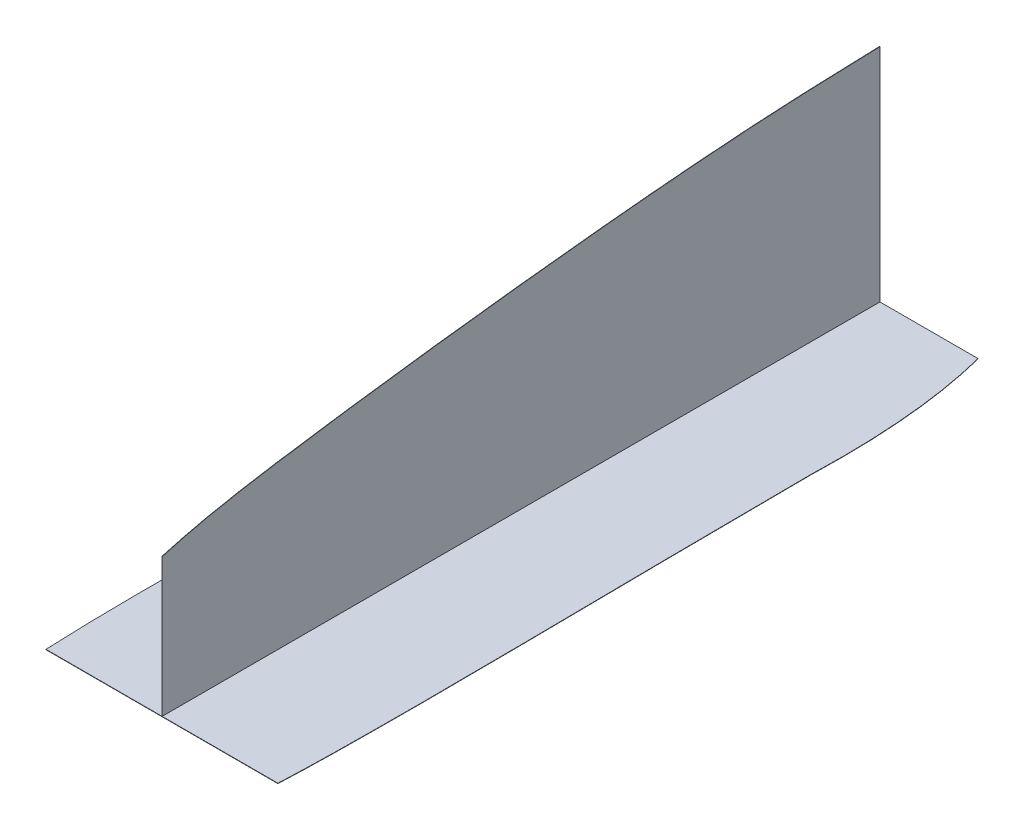
ISO-10303-21;
HEADER;
FILE_DESCRIPTION(('STEP AP214'),'2;1');
FILE_NAME('part.step','',(''),(''),'','','');
FILE_SCHEMA(('AUTOMOTIVE_DESIGN { 1 0 10303 214 1 1 1 1 }'));
ENDSEC;
DATA;
#1=APPLICATION_CONTEXT('core data for automotive mechanical design processes');
#2=APPLICATION_PROTOCOL_DEFINITION('international standard','automotive_design',2000,#1);
#3=PRODUCT_CONTEXT('',#1,'mechanical');
#4=PRODUCT('Part','Part','',(#3));
#5=PRODUCT_RELATED_PRODUCT_CATEGORY('part','',(#4));
#6=PRODUCT_DEFINITION_FORMATION('','',#4);
#7=PRODUCT_DEFINITION_CONTEXT('part definition',#1,'design');
#8=PRODUCT_DEFINITION('design','',#6,#7);
#9=PRODUCT_DEFINITION_SHAPE('','',#8);
#10=(LENGTH_UNIT() NAMED_UNIT(*) SI_UNIT(.MILLI.,.METRE.));
#11=(NAMED_UNIT(*) PLANE_ANGLE_UNIT() SI_UNIT($,.RADIAN.));
#12=(NAMED_UNIT(*) SI_UNIT($,.STERADIAN.) SOLID_ANGLE_UNIT());
#13=UNCERTAINTY_MEASURE_WITH_UNIT(LENGTH_MEASURE(1.E-05),#10,'distance_accuracy_value','');
#14=(GEOMETRIC_REPRESENTATION_CONTEXT(3) GLOBAL_UNCERTAINTY_ASSIGNED_CONTEXT((#13)) GLOBAL_UNIT_ASSIGNED_CONTEXT((#10,
#11,#12)) REPRESENTATION_CONTEXT('',''));
#15=CARTESIAN_POINT('',(0.,0.,0.));
#16=DIRECTION('',(0.,0.,1.));
#17=DIRECTION('',(1.,0.,0.));
#18=AXIS2_PLACEMENT_3D('',#15,#16,#17);
#19=CARTESIAN_POINT('',(589.383947508384,1009.16071536453,602.1399116742));
#20=DIRECTION('',(1.,0.,0.));
#21=DIRECTION('',(0.,0.,-1.));
#22=AXIS2_PLACEMENT_3D('',#19,#20,#21);
#23=PLANE('',#22);
#24=DIRECTION('',(0.,-1.,0.));
#25=VECTOR('',#24,1.);
#26=CARTESIAN_POINT('',(589.383947508384,1009.16071536453,602.1399116742));
#27=LINE('',#26,#25);
#28=CARTESIAN_POINT('',(589.383947508384,1611.78849720543,602.1399116742));
#29=VERTEX_POINT('',#28);
#30=CARTESIAN_POINT('',(589.383947508384,1010.16071536453,602.1399116742));
#31=VERTEX_POINT('',#30);
#32=EDGE_CURVE('E52',#29,#31,#27,.T.);
#33=ORIENTED_EDGE('',*,*,#32,.T.);
#34=DIRECTION('',(0.,0.,1.));
#35=VECTOR('',#34,1.);
#36=CARTESIAN_POINT('',(589.383947508384,1010.16071536453,602.1399116742));
#37=LINE('',#36,#35);
#38=CARTESIAN_POINT('',(589.383947508384,1010.16071536453,2554.9524376359));
#39=VERTEX_POINT('',#38);
#40=EDGE_CURVE('E56',#31,#39,#37,.T.);
#41=ORIENTED_EDGE('',*,*,#40,.T.);
#42=DIRECTION('',(0.,-1.,0.));
#43=VECTOR('',#42,1.);
#44=CARTESIAN_POINT('',(589.383947508384,1009.16071536453,2554.9524376359));
#45=LINE('',#44,#43);
#46=CARTESIAN_POINT('',(589.383947508384,1386.42141994183,2554.9524376359));
#47=VERTEX_POINT('',#46);
#48=EDGE_CURVE('E340',#47,#39,#45,.T.);
#49=ORIENTED_EDGE('',*,*,#48,.F.);
#50=CARTESIAN_POINT('',(589.383947508384,1563.05007326583,1355.1524376188));
#51=CARTESIAN_POINT('',(589.383947508384,1532.3402899185,1661.8874997417));
#52=CARTESIAN_POINT('',(589.383947508385,1476.98103839461,2092.25057555961));
#53=CARTESIAN_POINT('',(589.383947508385,1424.39977596157,2408.98943516324));
#54=CARTESIAN_POINT('',(589.383947508385,1398.89169061797,2511.88013056057));
#55=CARTESIAN_POINT('',(589.383947508385,1386.42141994183,2554.9524376359));
#56=B_SPLINE_CURVE_WITH_KNOTS('',3,(#50,#51,#52,#53,#54,#55),.UNSPECIFIED.,.F.,.F.,(4,1,1,4),
(0.108777165329481,0.189662496599539,0.216203450861303,0.238160453777761),.UNSPECIFIED.);
#57=CARTESIAN_POINT('',(589.383947508384,1563.05007326583,1355.1524376188));
#58=VERTEX_POINT('',#57);
#59=EDGE_CURVE('E263',#58,#47,#56,.T.);
#60=ORIENTED_EDGE('',*,*,#59,.F.);
#61=CARTESIAN_POINT('',(589.383947508384,1611.78849720543,602.1399116742));
#62=CARTESIAN_POINT('',(589.383947508384,1608.27208834806,715.657069267075));
#63=CARTESIAN_POINT('',(589.383947508384,1601.34313937165,931.648537269468));
#64=CARTESIAN_POINT('',(589.383947508384,1577.70214267697,1208.76652661467));
#65=CARTESIAN_POINT('',(589.383947508384,1563.05007326583,1355.1524376188));
#66=B_SPLINE_CURVE_WITH_KNOTS('',3,(#61,#62,#63,#64,#65),.UNSPECIFIED.,.F.,.F.,(4,1,4),
(0.0336353400705244,0.0701384805700576,0.10874200477284),.UNSPECIFIED.);
#67=EDGE_CURVE('E270',#29,#58,#66,.T.);
#68=ORIENTED_EDGE('',*,*,#67,.F.);
#69=EDGE_LOOP('',(#33,#41,#49,#60,#68));
#70=FACE_BOUND('',#69,.T.);
#71=ADVANCED_FACE('F36',(#70),#23,.F.);
#72=CARTESIAN_POINT('',(590.383947508384,1009.16071536453,602.1399116742));
#73=DIRECTION('',(-1.,0.,0.));
#74=DIRECTION('',(0.,0.,1.));
#75=AXIS2_PLACEMENT_3D('',#72,#73,#74);
#76=PLANE('',#75);
#77=DIRECTION('',(0.,-1.,0.));
#78=VECTOR('',#77,1.);
#79=CARTESIAN_POINT('',(590.383947508384,1009.16071536453,2554.9524376359));
#80=LINE('',#79,#78);
#81=CARTESIAN_POINT('',(590.383947508384,1386.42141994183,2554.9524376359));
#82=VERTEX_POINT('',#81);
#83=CARTESIAN_POINT('',(590.383947508384,1010.16071536453,2554.9524376359));
#84=VERTEX_POINT('',#83);
#85=EDGE_CURVE('E338',#82,#84,#80,.T.);
#86=ORIENTED_EDGE('',*,*,#85,.T.);
#87=DIRECTION('',(0.,0.,-1.));
#88=VECTOR('',#87,1.);
#89=CARTESIAN_POINT('',(590.383947508384,1010.16071536453,602.1399116742));
#90=LINE('',#89,#88);
#91=CARTESIAN_POINT('',(590.383947508384,1010.16071536453,602.1399116742));
#92=VERTEX_POINT('',#91);
#93=EDGE_CURVE('E11',#84,#92,#90,.T.);
#94=ORIENTED_EDGE('',*,*,#93,.T.);
#95=DIRECTION('',(0.,-1.,0.));
#96=VECTOR('',#95,1.);
#97=CARTESIAN_POINT('',(590.383947508384,1009.16071536453,602.1399116742));
#98=LINE('',#97,#96);
#99=CARTESIAN_POINT('',(590.383947508384,1611.78849720543,602.1399116742));
#100=VERTEX_POINT('',#99);
#101=EDGE_CURVE('E273',#100,#92,#98,.T.);
#102=ORIENTED_EDGE('',*,*,#101,.F.);
#103=CARTESIAN_POINT('',(590.383947508384,1611.78849720543,602.1399116742));
#104=CARTESIAN_POINT('',(590.383947508384,1608.27208834806,715.657069267075));
#105=CARTESIAN_POINT('',(590.383947508384,1601.34313937165,931.648537269468));
#106=CARTESIAN_POINT('',(590.383947508384,1577.70214267697,1208.76652661467));
#107=CARTESIAN_POINT('',(590.383947508384,1563.05007326583,1355.1524376188));
#108=B_SPLINE_CURVE_WITH_KNOTS('',3,(#103,#104,#105,#106,#107),.UNSPECIFIED.,.F.,.F.,(4,1,4),
(0.0336353400705244,0.0701384805700576,0.10874200477284),.UNSPECIFIED.);
#109=CARTESIAN_POINT('',(590.383947508385,1563.05007326583,1355.1524376188));
#110=VERTEX_POINT('',#109);
#111=EDGE_CURVE('E268',#110,#100,#108,.F.);
#112=ORIENTED_EDGE('',*,*,#111,.F.);
#113=CARTESIAN_POINT('',(590.383947508384,1563.05007326583,1355.1524376188));
#114=CARTESIAN_POINT('',(590.383947508384,1532.3402899185,1661.8874997417));
#115=CARTESIAN_POINT('',(590.383947508385,1476.98103839461,2092.25057555961));
#116=CARTESIAN_POINT('',(590.383947508385,1424.39977596157,2408.98943516324));
#117=CARTESIAN_POINT('',(590.383947508385,1398.89169061797,2511.88013056057));
#118=CARTESIAN_POINT('',(590.383947508385,1386.42141994183,2554.9524376359));
#119=B_SPLINE_CURVE_WITH_KNOTS('',3,(#113,#114,#115,#116,#117,#118),.UNSPECIFIED.,.F.,.F.,(4,1,
1,4),(0.108777165329481,0.189662496599539,0.216203450861303,0.238160453777761),.UNSPECIFIED.);
#120=EDGE_CURVE('E264',#82,#110,#119,.F.);
#121=ORIENTED_EDGE('',*,*,#120,.F.);
#122=EDGE_LOOP('',(#86,#94,#102,#112,#121));
#123=FACE_BOUND('',#122,.T.);
#124=ADVANCED_FACE('F225',(#123),#76,.F.);
#125=CARTESIAN_POINT('',(591.226262617765,1009.16071536453,674.1824168609));
#126=DIRECTION('',(0.,1.,0.));
#127=DIRECTION('',(1.,0.,0.));
#128=AXIS2_PLACEMENT_3D('',#125,#126,#127);
#129=PLANE('',#128);
#130=CARTESIAN_POINT('',(276.879543113384,1009.16071536453,1104.52250880301));
#131=CARTESIAN_POINT('',(270.241487642476,1009.16071536453,891.877004997745));
#132=CARTESIAN_POINT('',(290.003561901656,1009.16071536453,729.137352184355));
#133=CARTESIAN_POINT('',(322.642804705584,1009.16071536453,602.139911702002));
#134=B_SPLINE_CURVE_WITH_KNOTS('',3,(#130,#131,#132,#133),.UNSPECIFIED.,.F.,.F.,(4,4),
(0.571508355999422,1.),.UNSPECIFIED.);
#135=CARTESIAN_POINT('',(276.879543113384,1009.16071536453,1104.52250880301));
#136=VERTEX_POINT('',#135);
#137=CARTESIAN_POINT('',(322.642804705584,1009.16071536453,602.139911702002));
#138=VERTEX_POINT('',#137);
#139=EDGE_CURVE('E299',#136,#138,#134,.T.);
#140=ORIENTED_EDGE('',*,*,#139,.T.);
#141=DIRECTION('',(1.,0.,0.));
#142=VECTOR('',#141,1.);
#143=CARTESIAN_POINT('',(1034.32862425326,1009.16071536453,602.139911672));
#144=LINE('',#143,#142);
#145=CARTESIAN_POINT('',(857.122462797984,1009.16071536453,602.139911674201));
#146=VERTEX_POINT('',#145);
#147=EDGE_CURVE('E242',#138,#146,#144,.T.);
#148=ORIENTED_EDGE('',*,*,#147,.T.);
#149=CARTESIAN_POINT('',(857.122462797984,1009.16071536453,602.139911702001));
#150=CARTESIAN_POINT('',(889.761705601913,1009.16071536453,729.137352184355));
#151=CARTESIAN_POINT('',(909.523779861092,1009.16071536453,891.877004997746));
#152=CARTESIAN_POINT('',(902.885724390184,1009.16071536453,1104.52250880301));
#153=B_SPLINE_CURVE_WITH_KNOTS('',3,(#149,#150,#151,#152),.UNSPECIFIED.,.F.,.F.,(4,4),
(0.571508355999423,1.),.UNSPECIFIED.);
#154=CARTESIAN_POINT('',(902.885724390184,1009.16071536453,1104.52250880301));
#155=VERTEX_POINT('',#154);
#156=EDGE_CURVE('E296',#146,#155,#153,.T.);
#157=ORIENTED_EDGE('',*,*,#156,.T.);
#158=CARTESIAN_POINT('',(902.885724390184,1009.16071536453,1104.52250880301));
#159=CARTESIAN_POINT('',(903.672508803951,1009.16071536453,1233.03363169881));
#160=CARTESIAN_POINT('',(904.572435632125,1009.16071536453,1361.54390319702));
#161=CARTESIAN_POINT('',(905.565286362784,1009.16071536453,1490.0534754421));
#162=B_SPLINE_CURVE_WITH_KNOTS('',3,(#158,#159,#160,#161),.UNSPECIFIED.,.F.,.F.,(4,4),(0.,1.),.UNSPECIFIED.);
#163=CARTESIAN_POINT('',(905.561145012896,1009.16071536453,1489.51737029427));
#164=VERTEX_POINT('',#163);
#165=EDGE_CURVE('E308',#155,#164,#162,.T.);
#166=ORIENTED_EDGE('',*,*,#165,.T.);
#167=DIRECTION('',(-0.00775795305478673,0.,-0.999969906629394));
#168=VECTOR('',#167,1.);
#169=CARTESIAN_POINT('',(905.585482838039,1009.16071536453,1492.65442108127));
#170=LINE('',#169,#168);
#171=CARTESIAN_POINT('',(905.585482838039,1009.16071536453,1492.65442108127));
#172=VERTEX_POINT('',#171);
#173=EDGE_CURVE('E468',#172,#164,#170,.T.);
#174=ORIENTED_EDGE('',*,*,#173,.F.);
#175=CARTESIAN_POINT('',(905.565286362784,1009.16071536453,1490.0534754421));
#176=CARTESIAN_POINT('',(907.915875001607,1009.16071536453,1794.24613705781));
#177=CARTESIAN_POINT('',(914.310196912963,1009.16071536453,2098.51376508695));
#178=CARTESIAN_POINT('',(909.770934228902,1009.16071536453,2402.61644224091));
#179=B_SPLINE_CURVE_WITH_KNOTS('',3,(#175,#176,#177,#178),.UNSPECIFIED.,.F.,.F.,(4,4),(0.,1.),.UNSPECIFIED.);
#180=CARTESIAN_POINT('',(909.770934228902,1009.16071536453,2402.61644224091));
#181=VERTEX_POINT('',#180);
#182=EDGE_CURVE('E474',#172,#181,#179,.T.);
#183=ORIENTED_EDGE('',*,*,#182,.T.);
#184=DIRECTION('',(-0.0149255916419641,0.,0.999888607152886));
#185=VECTOR('',#184,1.);
#186=CARTESIAN_POINT('',(909.770934228902,1009.16071536453,2402.61644224091));
#187=LINE('',#186,#185);
#188=CARTESIAN_POINT('',(909.770828491298,1009.16071536453,2402.62352576752));
#189=VERTEX_POINT('',#188);
#190=EDGE_CURVE('E478',#181,#189,#187,.T.);
#191=ORIENTED_EDGE('',*,*,#190,.T.);
#192=CARTESIAN_POINT('',(909.770828491298,1009.16071536453,2402.62352576752));
#193=CARTESIAN_POINT('',(909.012624359779,1009.16071536453,2453.41506199992));
#194=CARTESIAN_POINT('',(907.695367575531,1009.16071536453,2504.19483774952));
#195=CARTESIAN_POINT('',(905.323947508384,1009.16071536453,2554.9524376466));
#196=B_SPLINE_CURVE_WITH_KNOTS('',3,(#192,#193,#194,#195),.UNSPECIFIED.,.F.,.F.,(4,4),(0.,1.),.UNSPECIFIED.);
#197=CARTESIAN_POINT('',(905.323947508384,1009.16071536453,2554.9524376466));
#198=VERTEX_POINT('',#197);
#199=EDGE_CURVE('E483',#189,#198,#196,.T.);
#200=ORIENTED_EDGE('',*,*,#199,.T.);
#201=DIRECTION('',(1.,0.,0.));
#202=VECTOR('',#201,1.);
#203=CARTESIAN_POINT('',(264.753636337917,1009.16071536453,2554.9524376466));
#204=LINE('',#203,#202);
#205=CARTESIAN_POINT('',(274.441319995184,1009.16071536453,2554.9524376466));
#206=VERTEX_POINT('',#205);
#207=EDGE_CURVE('E179',#206,#198,#204,.T.);
#208=ORIENTED_EDGE('',*,*,#207,.F.);
#209=CARTESIAN_POINT('',(274.441319995184,1009.16071536453,2554.9524376466));
#210=CARTESIAN_POINT('',(266.156255187132,1009.16071536453,2377.61987203674));
#211=CARTESIAN_POINT('',(268.71985785069,1009.16071536453,2200.05517892387));
#212=CARTESIAN_POINT('',(271.168372512958,1009.16071536453,1845.05258119717));
#213=CARTESIAN_POINT('',(272.82838089259,1009.16071536453,1667.55400585533));
#214=CARTESIAN_POINT('',(274.199981140784,1009.16071536453,1490.0534754421));
#215=B_SPLINE_CURVE_WITH_KNOTS('',3,(#209,#210,#211,#212,#213,#214),.UNSPECIFIED.,.F.,.F.,(4,2,
4),(0.,0.5,1.),.UNSPECIFIED.);
#216=CARTESIAN_POINT('',(274.193391193962,1009.16071536453,1490.90600220537));
#217=VERTEX_POINT('',#216);
#218=EDGE_CURVE('E319',#206,#217,#215,.T.);
#219=ORIENTED_EDGE('',*,*,#218,.T.);
#220=DIRECTION('',(-0.0077261395766045,0.,0.999970152938198));
#221=VECTOR('',#220,1.);
#222=CARTESIAN_POINT('',(274.208823615225,1009.16071536453,1488.90863204427));
#223=LINE('',#222,#221);
#224=CARTESIAN_POINT('',(274.208823615225,1009.16071536453,1488.90863204427));
#225=VERTEX_POINT('',#224);
#226=EDGE_CURVE('E162',#225,#217,#223,.T.);
#227=ORIENTED_EDGE('',*,*,#226,.F.);
#228=CARTESIAN_POINT('',(274.199981140784,1009.16071536453,1490.0534754421));
#229=CARTESIAN_POINT('',(275.192831872416,1009.16071536453,1361.54390307109));
#230=CARTESIAN_POINT('',(276.09275870044,1009.16071536453,1233.03363156436));
#231=CARTESIAN_POINT('',(276.879543113384,1009.16071536453,1104.52250880301));
#232=B_SPLINE_CURVE_WITH_KNOTS('',3,(#228,#229,#230,#231),.UNSPECIFIED.,.F.,.F.,(4,4),(0.,1.),.UNSPECIFIED.);
#233=EDGE_CURVE('E447',#225,#136,#232,.T.);
#234=ORIENTED_EDGE('',*,*,#233,.T.);
#235=EDGE_LOOP('',(#140,#148,#157,#166,#174,#183,#191,#200,#208,#219,#227,#234));
#236=FACE_BOUND('',#235,.T.);
#237=ADVANCED_FACE('F228',(#236),#129,.F.);
#238=CARTESIAN_POINT('',(591.226262617765,1197.77104661873,602.1399116742));
#239=DIRECTION('',(0.,0.,1.));
#240=DIRECTION('',(1.,0.,0.));
#241=AXIS2_PLACEMENT_3D('',#238,#239,#240);
#242=PLANE('',#241);
#243=ORIENTED_EDGE('',*,*,#101,.T.);
#244=DIRECTION('',(-1.,0.,0.));
#245=VECTOR('',#244,1.);
#246=CARTESIAN_POINT('',(392.759972132284,1010.16071536453,602.139911674201));
#247=LINE('',#246,#245);
#248=CARTESIAN_POINT('',(857.122462797984,1010.16071536453,602.139911674201));
#249=VERTEX_POINT('',#248);
#250=EDGE_CURVE('E312',#249,#92,#247,.T.);
#251=ORIENTED_EDGE('',*,*,#250,.F.);
#252=DIRECTION('',(0.,1.,0.));
#253=VECTOR('',#252,1.);
#254=CARTESIAN_POINT('',(857.122462797984,1008.67078649442,602.139911702001));
#255=LINE('',#254,#253);
#256=EDGE_CURVE('E195',#146,#249,#255,.T.);
#257=ORIENTED_EDGE('',*,*,#256,.F.);
#258=ORIENTED_EDGE('',*,*,#147,.F.);
#259=DIRECTION('',(0.,1.,0.));
#260=VECTOR('',#259,1.);
#261=CARTESIAN_POINT('',(322.642804705584,1008.67078649443,602.139911702002));
#262=LINE('',#261,#260);
#263=CARTESIAN_POINT('',(322.642804705584,1010.16071536453,602.139911702002));
#264=VERTEX_POINT('',#263);
#265=EDGE_CURVE('E180',#138,#264,#262,.T.);
#266=ORIENTED_EDGE('',*,*,#265,.T.);
#267=EDGE_CURVE('E343',#31,#264,#247,.T.);
#268=ORIENTED_EDGE('',*,*,#267,.F.);
#269=ORIENTED_EDGE('',*,*,#32,.F.);
#270=DIRECTION('',(-1.,0.,0.));
#271=VECTOR('',#270,1.);
#272=CARTESIAN_POINT('',(591.226262617765,1611.78849720543,602.1399116742));
#273=LINE('',#272,#271);
#274=EDGE_CURVE('E249',#100,#29,#273,.T.);
#275=ORIENTED_EDGE('',*,*,#274,.F.);
#276=EDGE_LOOP('',(#243,#251,#257,#258,#266,#268,#269,#275));
#277=FACE_BOUND('',#276,.T.);
#278=ADVANCED_FACE('F234',(#277),#242,.F.);
#279=CARTESIAN_POINT('',(591.226262617765,1563.05007326583,1355.1524376188));
#280=CARTESIAN_POINT('',(591.226262617765,1532.3402899185,1661.8874997417));
#281=CARTESIAN_POINT('',(591.226262617766,1476.98103839461,2092.25057555961));
#282=CARTESIAN_POINT('',(591.226262617766,1424.39977596157,2408.98943516324));
#283=CARTESIAN_POINT('',(591.226262617766,1398.89169061797,2511.88013056057));
#284=CARTESIAN_POINT('',(591.226262617766,1386.42141994183,2554.9524376359));
#285=B_SPLINE_CURVE_WITH_KNOTS('',3,(#279,#280,#281,#282,#283,#284),.UNSPECIFIED.,.F.,.F.,(4,1,
1,4),(0.108777165329481,0.189662496599539,0.216203450861303,0.238160453777761),.UNSPECIFIED.);
#286=DIRECTION('',(-1.,0.,0.));
#287=VECTOR('',#286,1.);
#288=SURFACE_OF_LINEAR_EXTRUSION('',#285,#287);
#289=DIRECTION('',(-1.,0.,0.));
#290=VECTOR('',#289,1.);
#291=CARTESIAN_POINT('',(591.226262617766,1386.42141994183,2554.9524376359));
#292=LINE('',#291,#290);
#293=EDGE_CURVE('E244',#82,#47,#292,.T.);
#294=ORIENTED_EDGE('',*,*,#293,.F.);
#295=ORIENTED_EDGE('',*,*,#120,.T.);
#296=DIRECTION('',(-1.,0.,0.));
#297=VECTOR('',#296,1.);
#298=CARTESIAN_POINT('',(591.226262617765,1563.05007326583,1355.1524376188));
#299=LINE('',#298,#297);
#300=EDGE_CURVE('E45',#110,#58,#299,.T.);
#301=ORIENTED_EDGE('',*,*,#300,.T.);
#302=ORIENTED_EDGE('',*,*,#59,.T.);
#303=EDGE_LOOP('',(#294,#295,#301,#302));
#304=FACE_BOUND('',#303,.T.);
#305=ADVANCED_FACE('F230',(#304),#288,.F.);
#306=CARTESIAN_POINT('',(507.638417351715,1059.20075743343,2554.9524376466));
#307=DIRECTION('',(0.,0.,1.));
#308=DIRECTION('',(1.,0.,0.));
#309=AXIS2_PLACEMENT_3D('',#306,#307,#308);
#310=PLANE('',#309);
#311=ORIENTED_EDGE('',*,*,#48,.T.);
#312=DIRECTION('',(-1.,0.,0.));
#313=VECTOR('',#312,1.);
#314=CARTESIAN_POINT('',(264.753636337917,1010.16071536453,2554.9524376466));
#315=LINE('',#314,#313);
#316=CARTESIAN_POINT('',(274.441319995184,1010.16071536453,2554.9524376466));
#317=VERTEX_POINT('',#316);
#318=EDGE_CURVE('E163',#39,#317,#315,.T.);
#319=ORIENTED_EDGE('',*,*,#318,.T.);
#320=DIRECTION('',(0.,1.,0.));
#321=VECTOR('',#320,1.);
#322=CARTESIAN_POINT('',(274.441319995184,1008.67078649443,2554.9524376466));
#323=LINE('',#322,#321);
#324=EDGE_CURVE('E173',#206,#317,#323,.T.);
#325=ORIENTED_EDGE('',*,*,#324,.F.);
#326=ORIENTED_EDGE('',*,*,#207,.T.);
#327=DIRECTION('',(0.,1.,0.));
#328=VECTOR('',#327,1.);
#329=CARTESIAN_POINT('',(905.323947508384,1008.67078649443,2554.9524376466));
#330=LINE('',#329,#328);
#331=CARTESIAN_POINT('',(905.323947508384,1010.16071536453,2554.9524376466));
#332=VERTEX_POINT('',#331);
#333=EDGE_CURVE('E170',#198,#332,#330,.T.);
#334=ORIENTED_EDGE('',*,*,#333,.T.);
#335=EDGE_CURVE('E153',#332,#84,#315,.T.);
#336=ORIENTED_EDGE('',*,*,#335,.T.);
#337=ORIENTED_EDGE('',*,*,#85,.F.);
#338=ORIENTED_EDGE('',*,*,#293,.T.);
#339=EDGE_LOOP('',(#311,#319,#325,#326,#334,#336,#337,#338));
#340=FACE_BOUND('',#339,.T.);
#341=ADVANCED_FACE('F177',(#340),#310,.T.);
#342=CARTESIAN_POINT('',(591.226262617765,1611.78849720543,602.1399116742));
#343=CARTESIAN_POINT('',(591.226262617765,1608.27208834806,715.657069267075));
#344=CARTESIAN_POINT('',(591.226262617765,1601.34313937165,931.648537269468));
#345=CARTESIAN_POINT('',(591.226262617765,1577.70214267697,1208.76652661467));
#346=CARTESIAN_POINT('',(591.226262617765,1563.05007326583,1355.1524376188));
#347=B_SPLINE_CURVE_WITH_KNOTS('',3,(#342,#343,#344,#345,#346),.UNSPECIFIED.,.F.,.F.,(4,1,4),
(0.0336353400705244,0.0701384805700576,0.10874200477284),.UNSPECIFIED.);
#348=DIRECTION('',(-1.,0.,0.));
#349=VECTOR('',#348,1.);
#350=SURFACE_OF_LINEAR_EXTRUSION('',#347,#349);
#351=ORIENTED_EDGE('',*,*,#300,.F.);
#352=ORIENTED_EDGE('',*,*,#111,.T.);
#353=ORIENTED_EDGE('',*,*,#274,.T.);
#354=ORIENTED_EDGE('',*,*,#67,.T.);
#355=EDGE_LOOP('',(#351,#352,#353,#354));
#356=FACE_BOUND('',#355,.T.);
#357=ADVANCED_FACE('F38',(#356),#350,.F.);
#358=CARTESIAN_POINT('',(264.753636337917,1010.16071536453,602.139411702002));
#359=DIRECTION('',(0.,1.,0.));
#360=DIRECTION('',(0.,0.,1.));
#361=AXIS2_PLACEMENT_3D('',#358,#359,#360);
#362=PLANE('',#361);
#363=ORIENTED_EDGE('',*,*,#40,.F.);
#364=ORIENTED_EDGE('',*,*,#267,.T.);
#365=CARTESIAN_POINT('',(276.879543113384,1010.16071536453,1104.52250880301));
#366=CARTESIAN_POINT('',(270.241487642476,1010.16071536453,891.877004997745));
#367=CARTESIAN_POINT('',(290.003561901656,1010.16071536453,729.137352184355));
#368=CARTESIAN_POINT('',(322.642804705584,1010.16071536453,602.139911702002));
#369=B_SPLINE_CURVE_WITH_KNOTS('',3,(#365,#366,#367,#368),.UNSPECIFIED.,.F.,.F.,(4,4),
(0.571508355999422,1.),.UNSPECIFIED.);
#370=CARTESIAN_POINT('',(276.879543113384,1010.16071536453,1104.52250880301));
#371=VERTEX_POINT('',#370);
#372=EDGE_CURVE('E347',#264,#371,#369,.F.);
#373=ORIENTED_EDGE('',*,*,#372,.T.);
#374=CARTESIAN_POINT('',(274.199981140784,1010.16071536453,1490.0534754421));
#375=CARTESIAN_POINT('',(275.192831872416,1010.16071536453,1361.54390307109));
#376=CARTESIAN_POINT('',(276.09275870044,1010.16071536453,1233.03363156436));
#377=CARTESIAN_POINT('',(276.879543113384,1010.16071536453,1104.52250880301));
#378=B_SPLINE_CURVE_WITH_KNOTS('',3,(#374,#375,#376,#377),.UNSPECIFIED.,.F.,.F.,(4,4),(0.,1.),.UNSPECIFIED.);
#379=CARTESIAN_POINT('',(274.208823615225,1010.16071536453,1488.90863204427));
#380=VERTEX_POINT('',#379);
#381=EDGE_CURVE('E437',#371,#380,#378,.F.);
#382=ORIENTED_EDGE('',*,*,#381,.T.);
#383=DIRECTION('',(0.0077261395766045,0.,-0.999970152938198));
#384=VECTOR('',#383,1.);
#385=CARTESIAN_POINT('',(274.208823615225,1010.16071536453,1488.90863204427));
#386=LINE('',#385,#384);
#387=CARTESIAN_POINT('',(274.193391193962,1010.16071536453,1490.90600220537));
#388=VERTEX_POINT('',#387);
#389=EDGE_CURVE('E487',#388,#380,#386,.T.);
#390=ORIENTED_EDGE('',*,*,#389,.F.);
#391=CARTESIAN_POINT('',(274.441319995184,1010.16071536453,2554.9524376466));
#392=CARTESIAN_POINT('',(266.156255187132,1010.16071536453,2377.61987203674));
#393=CARTESIAN_POINT('',(268.71985785069,1010.16071536453,2200.05517892387));
#394=CARTESIAN_POINT('',(271.168372512958,1010.16071536453,1845.05258119717));
#395=CARTESIAN_POINT('',(272.82838089259,1010.16071536453,1667.55400585533));
#396=CARTESIAN_POINT('',(274.199981140784,1010.16071536453,1490.0534754421));
#397=B_SPLINE_CURVE_WITH_KNOTS('',3,(#391,#392,#393,#394,#395,#396),.UNSPECIFIED.,.F.,.F.,(4,2,
4),(0.,0.5,1.),.UNSPECIFIED.);
#398=EDGE_CURVE('E334',#388,#317,#397,.F.);
#399=ORIENTED_EDGE('',*,*,#398,.T.);
#400=ORIENTED_EDGE('',*,*,#318,.F.);
#401=EDGE_LOOP('',(#363,#364,#373,#382,#390,#399,#400));
#402=FACE_BOUND('',#401,.T.);
#403=ADVANCED_FACE('F395',(#402),#362,.T.);
#404=ORIENTED_EDGE('',*,*,#93,.F.);
#405=ORIENTED_EDGE('',*,*,#335,.F.);
#406=CARTESIAN_POINT('',(909.770828491298,1010.16071536453,2402.62352576752));
#407=CARTESIAN_POINT('',(909.012624359779,1010.16071536453,2453.41506199992));
#408=CARTESIAN_POINT('',(907.695367575531,1010.16071536453,2504.19483774952));
#409=CARTESIAN_POINT('',(905.323947508384,1010.16071536453,2554.9524376466));
#410=B_SPLINE_CURVE_WITH_KNOTS('',3,(#406,#407,#408,#409),.UNSPECIFIED.,.F.,.F.,(4,4),(0.,1.),.UNSPECIFIED.);
#411=CARTESIAN_POINT('',(909.770828491298,1010.16071536453,2402.62352576752));
#412=VERTEX_POINT('',#411);
#413=EDGE_CURVE('E156',#332,#412,#410,.F.);
#414=ORIENTED_EDGE('',*,*,#413,.T.);
#415=DIRECTION('',(0.0149255916419641,0.,-0.999888607152886));
#416=VECTOR('',#415,1.);
#417=CARTESIAN_POINT('',(909.770934228902,1010.16071536453,2402.61644224091));
#418=LINE('',#417,#416);
#419=CARTESIAN_POINT('',(909.770934228902,1010.16071536453,2402.61644224091));
#420=VERTEX_POINT('',#419);
#421=EDGE_CURVE('E174',#412,#420,#418,.T.);
#422=ORIENTED_EDGE('',*,*,#421,.T.);
#423=CARTESIAN_POINT('',(905.565286362784,1010.16071536453,1490.0534754421));
#424=CARTESIAN_POINT('',(907.915875001607,1010.16071536453,1794.24613705781));
#425=CARTESIAN_POINT('',(914.310196912963,1010.16071536453,2098.51376508695));
#426=CARTESIAN_POINT('',(909.770934228902,1010.16071536453,2402.61644224091));
#427=B_SPLINE_CURVE_WITH_KNOTS('',3,(#423,#424,#425,#426),.UNSPECIFIED.,.F.,.F.,(4,4),(0.,1.),.UNSPECIFIED.);
#428=CARTESIAN_POINT('',(905.585482838039,1010.16071536453,1492.65442108127));
#429=VERTEX_POINT('',#428);
#430=EDGE_CURVE('E367',#420,#429,#427,.F.);
#431=ORIENTED_EDGE('',*,*,#430,.T.);
#432=DIRECTION('',(0.00775795305478673,0.,0.999969906629394));
#433=VECTOR('',#432,1.);
#434=CARTESIAN_POINT('',(905.585482838039,1010.16071536453,1492.65442108127));
#435=LINE('',#434,#433);
#436=CARTESIAN_POINT('',(905.561145012896,1010.16071536453,1489.51737029427));
#437=VERTEX_POINT('',#436);
#438=EDGE_CURVE('E361',#437,#429,#435,.T.);
#439=ORIENTED_EDGE('',*,*,#438,.F.);
#440=CARTESIAN_POINT('',(902.885724390184,1010.16071536453,1104.52250880301));
#441=CARTESIAN_POINT('',(903.672508803951,1010.16071536453,1233.03363169881));
#442=CARTESIAN_POINT('',(904.572435632125,1010.16071536453,1361.54390319702));
#443=CARTESIAN_POINT('',(905.565286362784,1010.16071536453,1490.0534754421));
#444=B_SPLINE_CURVE_WITH_KNOTS('',3,(#440,#441,#442,#443),.UNSPECIFIED.,.F.,.F.,(4,4),(0.,1.),.UNSPECIFIED.);
#445=CARTESIAN_POINT('',(902.885724390184,1010.16071536453,1104.52250880301));
#446=VERTEX_POINT('',#445);
#447=EDGE_CURVE('E345',#437,#446,#444,.F.);
#448=ORIENTED_EDGE('',*,*,#447,.T.);
#449=CARTESIAN_POINT('',(857.122462797984,1010.16071536453,602.139911702001));
#450=CARTESIAN_POINT('',(889.761705601913,1010.16071536453,729.137352184355));
#451=CARTESIAN_POINT('',(909.523779861092,1010.16071536453,891.877004997746));
#452=CARTESIAN_POINT('',(902.885724390184,1010.16071536453,1104.52250880301));
#453=B_SPLINE_CURVE_WITH_KNOTS('',3,(#449,#450,#451,#452),.UNSPECIFIED.,.F.,.F.,(4,4),
(0.571508355999423,1.),.UNSPECIFIED.);
#454=EDGE_CURVE('E342',#446,#249,#453,.F.);
#455=ORIENTED_EDGE('',*,*,#454,.T.);
#456=ORIENTED_EDGE('',*,*,#250,.T.);
#457=EDGE_LOOP('',(#404,#405,#414,#422,#431,#439,#448,#455,#456));
#458=FACE_BOUND('',#457,.T.);
#459=ADVANCED_FACE('F155',(#458),#362,.T.);
#460=CARTESIAN_POINT('',(274.208823615225,1058.67078649443,1488.90863204427));
#461=DIRECTION('',(-0.999970152938198,0.,-0.0077261395766045));
#462=DIRECTION('',(-0.0077261395766045,0.,0.999970152938198));
#463=AXIS2_PLACEMENT_3D('',#460,#461,#462);
#464=PLANE('',#463);
#465=DIRECTION('',(0.,-1.,0.));
#466=VECTOR('',#465,1.);
#467=CARTESIAN_POINT('',(274.193391193962,1058.67078649443,1490.90600220537));
#468=LINE('',#467,#466);
#469=EDGE_CURVE('E320',#388,#217,#468,.T.);
#470=ORIENTED_EDGE('',*,*,#469,.F.);
#471=ORIENTED_EDGE('',*,*,#389,.T.);
#472=DIRECTION('',(0.,-1.,0.));
#473=VECTOR('',#472,1.);
#474=CARTESIAN_POINT('',(274.208823615225,1058.67078649443,1488.90863204427));
#475=LINE('',#474,#473);
#476=EDGE_CURVE('E316',#380,#225,#475,.T.);
#477=ORIENTED_EDGE('',*,*,#476,.T.);
#478=ORIENTED_EDGE('',*,*,#226,.T.);
#479=EDGE_LOOP('',(#470,#471,#477,#478));
#480=FACE_BOUND('',#479,.T.);
#481=ADVANCED_FACE('F216',(#480),#464,.T.);
#482=CARTESIAN_POINT('',(905.585482838039,1058.67078649443,1492.65442108127));
#483=DIRECTION('',(0.999969906629394,0.,-0.00775795305478673));
#484=DIRECTION('',(-0.00775795305478673,0.,-0.999969906629394));
#485=AXIS2_PLACEMENT_3D('',#482,#483,#484);
#486=PLANE('',#485);
#487=DIRECTION('',(0.,-1.,0.));
#488=VECTOR('',#487,1.);
#489=CARTESIAN_POINT('',(905.561145012896,1058.67078649443,1489.51737029427));
#490=LINE('',#489,#488);
#491=EDGE_CURVE('E313',#437,#164,#490,.T.);
#492=ORIENTED_EDGE('',*,*,#491,.F.);
#493=ORIENTED_EDGE('',*,*,#438,.T.);
#494=DIRECTION('',(0.,-1.,0.));
#495=VECTOR('',#494,1.);
#496=CARTESIAN_POINT('',(905.585482838039,1058.67078649443,1492.65442108127));
#497=LINE('',#496,#495);
#498=EDGE_CURVE('E323',#429,#172,#497,.T.);
#499=ORIENTED_EDGE('',*,*,#498,.T.);
#500=ORIENTED_EDGE('',*,*,#173,.T.);
#501=EDGE_LOOP('',(#492,#493,#499,#500));
#502=FACE_BOUND('',#501,.T.);
#503=ADVANCED_FACE('F213',(#502),#486,.T.);
#504=CARTESIAN_POINT('',(857.122462797984,1008.67078649442,602.139911702001));
#505=CARTESIAN_POINT('',(889.761705601913,1008.67078649442,729.137352184355));
#506=CARTESIAN_POINT('',(909.523779861092,1008.67078649442,891.877004997746));
#507=CARTESIAN_POINT('',(902.885724390184,1008.67078649442,1104.52250880301));
#508=B_SPLINE_CURVE_WITH_KNOTS('',3,(#504,#505,#506,#507),.UNSPECIFIED.,.F.,.F.,(4,4),
(0.571508355999423,1.),.UNSPECIFIED.);
#509=DIRECTION('',(0.,1.,0.));
#510=VECTOR('',#509,1.);
#511=SURFACE_OF_LINEAR_EXTRUSION('',#508,#510);
#512=ORIENTED_EDGE('',*,*,#454,.F.);
#513=DIRECTION('',(0.,1.,0.));
#514=VECTOR('',#513,1.);
#515=CARTESIAN_POINT('',(902.885724390184,1008.67078649442,1104.52250880301));
#516=LINE('',#515,#514);
#517=EDGE_CURVE('E307',#155,#446,#516,.T.);
#518=ORIENTED_EDGE('',*,*,#517,.F.);
#519=ORIENTED_EDGE('',*,*,#156,.F.);
#520=ORIENTED_EDGE('',*,*,#256,.T.);
#521=EDGE_LOOP('',(#512,#518,#519,#520));
#522=FACE_BOUND('',#521,.T.);
#523=ADVANCED_FACE('F208',(#522),#511,.F.);
#524=CARTESIAN_POINT('',(902.885724390184,1008.67078649442,1104.52250880301));
#525=CARTESIAN_POINT('',(903.672508803951,1008.67078649442,1233.03363169881));
#526=CARTESIAN_POINT('',(904.572435632125,1008.67078649442,1361.54390319702));
#527=CARTESIAN_POINT('',(905.565286362784,1008.67078649443,1490.0534754421));
#528=B_SPLINE_CURVE_WITH_KNOTS('',3,(#524,#525,#526,#527),.UNSPECIFIED.,.F.,.F.,(4,4),(0.,1.),.UNSPECIFIED.);
#529=DIRECTION('',(0.,1.,0.));
#530=VECTOR('',#529,1.);
#531=SURFACE_OF_LINEAR_EXTRUSION('',#528,#530);
#532=ORIENTED_EDGE('',*,*,#447,.F.);
#533=ORIENTED_EDGE('',*,*,#491,.T.);
#534=ORIENTED_EDGE('',*,*,#165,.F.);
#535=ORIENTED_EDGE('',*,*,#517,.T.);
#536=EDGE_LOOP('',(#532,#533,#534,#535));
#537=FACE_BOUND('',#536,.T.);
#538=ADVANCED_FACE('F212',(#537),#531,.F.);
#539=CARTESIAN_POINT('',(905.565286362784,1008.67078649443,1490.0534754421));
#540=CARTESIAN_POINT('',(907.915875001607,1008.67078649443,1794.24613705781));
#541=CARTESIAN_POINT('',(914.310196912963,1008.67078649443,2098.51376508695));
#542=CARTESIAN_POINT('',(909.770934228902,1008.67078649443,2402.61644224091));
#543=B_SPLINE_CURVE_WITH_KNOTS('',3,(#539,#540,#541,#542),.UNSPECIFIED.,.F.,.F.,(4,4),(0.,1.),.UNSPECIFIED.);
#544=DIRECTION('',(0.,1.,0.));
#545=VECTOR('',#544,1.);
#546=SURFACE_OF_LINEAR_EXTRUSION('',#543,#545);
#547=ORIENTED_EDGE('',*,*,#430,.F.);
#548=DIRECTION('',(0.,1.,0.));
#549=VECTOR('',#548,1.);
#550=CARTESIAN_POINT('',(909.770934228902,1008.67078649443,2402.61644224091));
#551=LINE('',#550,#549);
#552=EDGE_CURVE('E182',#181,#420,#551,.T.);
#553=ORIENTED_EDGE('',*,*,#552,.F.);
#554=ORIENTED_EDGE('',*,*,#182,.F.);
#555=ORIENTED_EDGE('',*,*,#498,.F.);
#556=EDGE_LOOP('',(#547,#553,#554,#555));
#557=FACE_BOUND('',#556,.T.);
#558=ADVANCED_FACE('F419',(#557),#546,.F.);
#559=CARTESIAN_POINT('',(909.770934228902,1008.67078649443,2402.61644224091));
#560=DIRECTION('',(-0.999888607152886,0.,-0.0149255916419641));
#561=DIRECTION('',(0.0149255916419641,0.,-0.999888607152886));
#562=AXIS2_PLACEMENT_3D('',#559,#560,#561);
#563=PLANE('',#562);
#564=ORIENTED_EDGE('',*,*,#421,.F.);
#565=DIRECTION('',(0.,1.,0.));
#566=VECTOR('',#565,1.);
#567=CARTESIAN_POINT('',(909.770828491298,1008.67078649443,2402.62352576752));
#568=LINE('',#567,#566);
#569=EDGE_CURVE('E172',#189,#412,#568,.T.);
#570=ORIENTED_EDGE('',*,*,#569,.F.);
#571=ORIENTED_EDGE('',*,*,#190,.F.);
#572=ORIENTED_EDGE('',*,*,#552,.T.);
#573=EDGE_LOOP('',(#564,#570,#571,#572));
#574=FACE_BOUND('',#573,.T.);
#575=ADVANCED_FACE('F422',(#574),#563,.F.);
#576=CARTESIAN_POINT('',(909.770828491298,1008.67078649443,2402.62352576752));
#577=CARTESIAN_POINT('',(909.012624359779,1008.67078649443,2453.41506199992));
#578=CARTESIAN_POINT('',(907.695367575531,1008.67078649443,2504.19483774952));
#579=CARTESIAN_POINT('',(905.323947508384,1008.67078649443,2554.9524376466));
#580=B_SPLINE_CURVE_WITH_KNOTS('',3,(#576,#577,#578,#579),.UNSPECIFIED.,.F.,.F.,(4,4),(0.,1.),.UNSPECIFIED.);
#581=DIRECTION('',(0.,1.,0.));
#582=VECTOR('',#581,1.);
#583=SURFACE_OF_LINEAR_EXTRUSION('',#580,#582);
#584=ORIENTED_EDGE('',*,*,#413,.F.);
#585=ORIENTED_EDGE('',*,*,#333,.F.);
#586=ORIENTED_EDGE('',*,*,#199,.F.);
#587=ORIENTED_EDGE('',*,*,#569,.T.);
#588=EDGE_LOOP('',(#584,#585,#586,#587));
#589=FACE_BOUND('',#588,.T.);
#590=ADVANCED_FACE('F168',(#589),#583,.F.);
#591=CARTESIAN_POINT('',(276.879543113384,1008.67078649443,1104.52250880301));
#592=CARTESIAN_POINT('',(270.241487642476,1008.67078649443,891.877004997745));
#593=CARTESIAN_POINT('',(290.003561901656,1008.67078649443,729.137352184355));
#594=CARTESIAN_POINT('',(322.642804705584,1008.67078649443,602.139911702002));
#595=B_SPLINE_CURVE_WITH_KNOTS('',3,(#591,#592,#593,#594),.UNSPECIFIED.,.F.,.F.,(4,4),
(0.571508355999422,1.),.UNSPECIFIED.);
#596=DIRECTION('',(0.,1.,0.));
#597=VECTOR('',#596,1.);
#598=SURFACE_OF_LINEAR_EXTRUSION('',#595,#597);
#599=ORIENTED_EDGE('',*,*,#372,.F.);
#600=ORIENTED_EDGE('',*,*,#265,.F.);
#601=ORIENTED_EDGE('',*,*,#139,.F.);
#602=DIRECTION('',(0.,1.,0.));
#603=VECTOR('',#602,1.);
#604=CARTESIAN_POINT('',(276.879543113384,1008.67078649443,1104.52250880301));
#605=LINE('',#604,#603);
#606=EDGE_CURVE('E185',#136,#371,#605,.T.);
#607=ORIENTED_EDGE('',*,*,#606,.T.);
#608=EDGE_LOOP('',(#599,#600,#601,#607));
#609=FACE_BOUND('',#608,.T.);
#610=ADVANCED_FACE('F399',(#609),#598,.F.);
#611=CARTESIAN_POINT('',(274.199981140784,1008.67078649443,1490.0534754421));
#612=CARTESIAN_POINT('',(275.192831872416,1008.67078649443,1361.54390307109));
#613=CARTESIAN_POINT('',(276.09275870044,1008.67078649443,1233.03363156436));
#614=CARTESIAN_POINT('',(276.879543113384,1008.67078649443,1104.52250880301));
#615=B_SPLINE_CURVE_WITH_KNOTS('',3,(#611,#612,#613,#614),.UNSPECIFIED.,.F.,.F.,(4,4),(0.,1.),.UNSPECIFIED.);
#616=DIRECTION('',(0.,1.,0.));
#617=VECTOR('',#616,1.);
#618=SURFACE_OF_LINEAR_EXTRUSION('',#615,#617);
#619=ORIENTED_EDGE('',*,*,#381,.F.);
#620=ORIENTED_EDGE('',*,*,#606,.F.);
#621=ORIENTED_EDGE('',*,*,#233,.F.);
#622=ORIENTED_EDGE('',*,*,#476,.F.);
#623=EDGE_LOOP('',(#619,#620,#621,#622));
#624=FACE_BOUND('',#623,.T.);
#625=ADVANCED_FACE('F393',(#624),#618,.F.);
#626=CARTESIAN_POINT('',(274.441319995184,1008.67078649443,2554.9524376466));
#627=CARTESIAN_POINT('',(266.156255187132,1008.67078649443,2377.61987203674));
#628=CARTESIAN_POINT('',(268.71985785069,1008.67078649443,2200.05517892387));
#629=CARTESIAN_POINT('',(271.168372512958,1008.67078649443,1845.05258119717));
#630=CARTESIAN_POINT('',(272.82838089259,1008.67078649443,1667.55400585533));
#631=CARTESIAN_POINT('',(274.199981140784,1008.67078649443,1490.0534754421));
#632=B_SPLINE_CURVE_WITH_KNOTS('',3,(#626,#627,#628,#629,#630,#631),.UNSPECIFIED.,.F.,.F.,(4,2,
4),(0.,0.5,1.),.UNSPECIFIED.);
#633=DIRECTION('',(0.,1.,0.));
#634=VECTOR('',#633,1.);
#635=SURFACE_OF_LINEAR_EXTRUSION('',#632,#634);
#636=ORIENTED_EDGE('',*,*,#398,.F.);
#637=ORIENTED_EDGE('',*,*,#469,.T.);
#638=ORIENTED_EDGE('',*,*,#218,.F.);
#639=ORIENTED_EDGE('',*,*,#324,.T.);
#640=EDGE_LOOP('',(#636,#637,#638,#639));
#641=FACE_BOUND('',#640,.T.);
#642=ADVANCED_FACE('F389',(#641),#635,.F.);
#643=CLOSED_SHELL('',(#71,#124,#237,#278,#305,#341,#357,#403,#459,#481,#503,#523,#538,#558,#575,
#590,#610,#625,#642));
#644=MANIFOLD_SOLID_BREP('B2',#643);
#645=ADVANCED_BREP_SHAPE_REPRESENTATION('',(#18,#644),#14);
#646=SHAPE_DEFINITION_REPRESENTATION(#9,#645);
ENDSEC;
END-ISO-10303-21;
